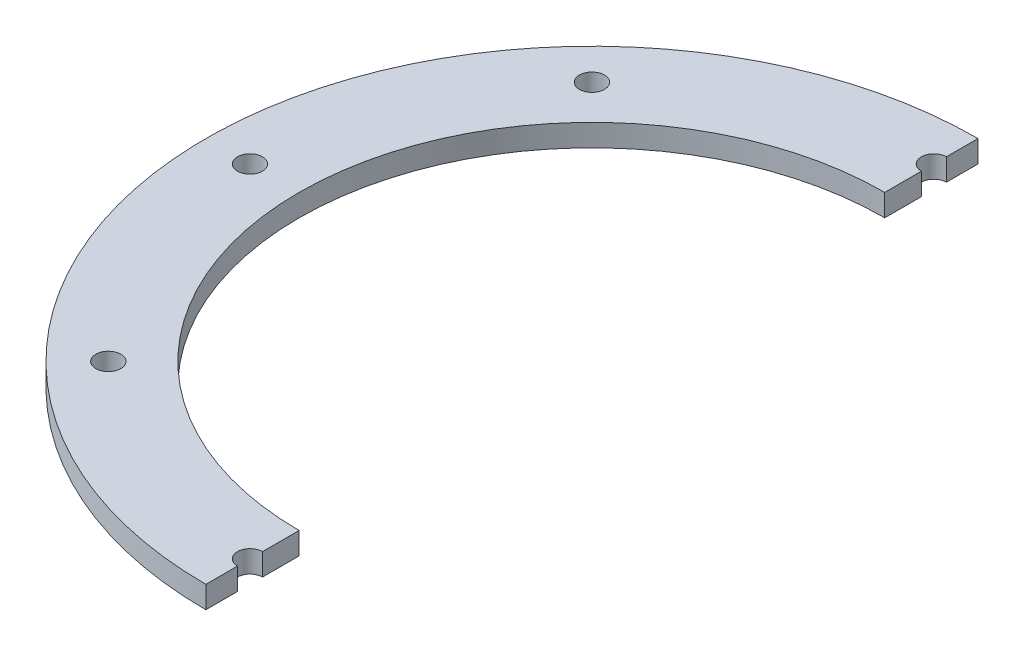
ISO-10303-21;
HEADER;
FILE_DESCRIPTION(('STEP AP214'),'2;1');
FILE_NAME('part.step','',(''),(''),'','','');
FILE_SCHEMA(('AUTOMOTIVE_DESIGN { 1 0 10303 214 1 1 1 1 }'));
ENDSEC;
DATA;
#1=APPLICATION_CONTEXT('core data for automotive mechanical design processes');
#2=APPLICATION_PROTOCOL_DEFINITION('international standard','automotive_design',2000,#1);
#3=PRODUCT_CONTEXT('',#1,'mechanical');
#4=PRODUCT('Part','Part','',(#3));
#5=PRODUCT_RELATED_PRODUCT_CATEGORY('part','',(#4));
#6=PRODUCT_DEFINITION_FORMATION('','',#4);
#7=PRODUCT_DEFINITION_CONTEXT('part definition',#1,'design');
#8=PRODUCT_DEFINITION('design','',#6,#7);
#9=PRODUCT_DEFINITION_SHAPE('','',#8);
#10=(LENGTH_UNIT() NAMED_UNIT(*) SI_UNIT(.MILLI.,.METRE.));
#11=(NAMED_UNIT(*) PLANE_ANGLE_UNIT() SI_UNIT($,.RADIAN.));
#12=(NAMED_UNIT(*) SI_UNIT($,.STERADIAN.) SOLID_ANGLE_UNIT());
#13=UNCERTAINTY_MEASURE_WITH_UNIT(LENGTH_MEASURE(1.E-05),#10,'distance_accuracy_value','');
#14=(GEOMETRIC_REPRESENTATION_CONTEXT(3) GLOBAL_UNCERTAINTY_ASSIGNED_CONTEXT((#13)) GLOBAL_UNIT_ASSIGNED_CONTEXT((#10,
#11,#12)) REPRESENTATION_CONTEXT('',''));
#15=CARTESIAN_POINT('',(0.,0.,0.));
#16=DIRECTION('',(0.,0.,1.));
#17=DIRECTION('',(1.,0.,0.));
#18=AXIS2_PLACEMENT_3D('',#15,#16,#17);
#19=CARTESIAN_POINT('',(0.,-3.,0.));
#20=DIRECTION('',(0.,-1.,0.));
#21=DIRECTION('',(0.,0.,-1.));
#22=AXIS2_PLACEMENT_3D('',#19,#20,#21);
#23=PLANE('',#22);
#24=CARTESIAN_POINT('',(-32.8804653251743,-3.,32.8804653251747));
#25=DIRECTION('',(0.,-1.,0.));
#26=DIRECTION('',(0.,0.,-1.));
#27=AXIS2_PLACEMENT_3D('',#24,#25,#26);
#28=CIRCLE('',#27,1.70000000000001);
#29=CARTESIAN_POINT('',(-32.8804653251743,-3.,31.1804653251746));
#30=VERTEX_POINT('',#29);
#31=EDGE_CURVE('E192',#30,#30,#28,.T.);
#32=ORIENTED_EDGE('',*,*,#31,.F.);
#33=EDGE_LOOP('',(#32));
#34=FACE_BOUND('',#33,.T.);
#35=CARTESIAN_POINT('',(0.,-3.,0.));
#36=DIRECTION('',(0.,1.,0.));
#37=DIRECTION('',(0.,0.,-1.));
#38=AXIS2_PLACEMENT_3D('',#35,#36,#37);
#39=CIRCLE('',#38,39.8164477613285);
#40=CARTESIAN_POINT('',(0.,-3.,-39.8164477613285));
#41=VERTEX_POINT('',#40);
#42=CARTESIAN_POINT('',(0.,-3.,39.8164477613285));
#43=VERTEX_POINT('',#42);
#44=EDGE_CURVE('E155',#41,#43,#39,.T.);
#45=ORIENTED_EDGE('',*,*,#44,.T.);
#46=DIRECTION('',(0.,0.,1.));
#47=VECTOR('',#46,1.);
#48=CARTESIAN_POINT('',(0.,-3.,44.8));
#49=LINE('',#48,#47);
#50=CARTESIAN_POINT('',(0.,-3.,44.8));
#51=VERTEX_POINT('',#50);
#52=EDGE_CURVE('E103',#43,#51,#49,.T.);
#53=ORIENTED_EDGE('',*,*,#52,.T.);
#54=CARTESIAN_POINT('',(0.,-3.,46.5));
#55=DIRECTION('',(0.,1.,0.));
#56=DIRECTION('',(0.,0.,-1.));
#57=AXIS2_PLACEMENT_3D('',#54,#55,#56);
#58=CIRCLE('',#57,1.7);
#59=CARTESIAN_POINT('',(0.,-3.,48.2));
#60=VERTEX_POINT('',#59);
#61=EDGE_CURVE('E170',#51,#60,#58,.T.);
#62=ORIENTED_EDGE('',*,*,#61,.T.);
#63=DIRECTION('',(0.,0.,1.));
#64=VECTOR('',#63,1.);
#65=CARTESIAN_POINT('',(0.,-3.,52.5));
#66=LINE('',#65,#64);
#67=CARTESIAN_POINT('',(0.,-3.,52.5));
#68=VERTEX_POINT('',#67);
#69=EDGE_CURVE('E183',#60,#68,#66,.T.);
#70=ORIENTED_EDGE('',*,*,#69,.T.);
#71=CARTESIAN_POINT('',(0.,-3.,0.));
#72=DIRECTION('',(0.,-1.,0.));
#73=DIRECTION('',(0.,0.,-1.));
#74=AXIS2_PLACEMENT_3D('',#71,#72,#73);
#75=CIRCLE('',#74,52.5);
#76=CARTESIAN_POINT('',(0.,-3.,-52.5));
#77=VERTEX_POINT('',#76);
#78=EDGE_CURVE('E122',#68,#77,#75,.T.);
#79=ORIENTED_EDGE('',*,*,#78,.T.);
#80=DIRECTION('',(0.,0.,1.));
#81=VECTOR('',#80,1.);
#82=CARTESIAN_POINT('',(0.,-3.,-48.2));
#83=LINE('',#82,#81);
#84=CARTESIAN_POINT('',(0.,-3.,-48.2));
#85=VERTEX_POINT('',#84);
#86=EDGE_CURVE('E116',#77,#85,#83,.T.);
#87=ORIENTED_EDGE('',*,*,#86,.T.);
#88=CARTESIAN_POINT('',(0.,-3.,-46.5));
#89=DIRECTION('',(0.,1.,0.));
#90=DIRECTION('',(0.,0.,-1.));
#91=AXIS2_PLACEMENT_3D('',#88,#89,#90);
#92=CIRCLE('',#91,1.7);
#93=CARTESIAN_POINT('',(0.,-3.,-44.8));
#94=VERTEX_POINT('',#93);
#95=EDGE_CURVE('E120',#85,#94,#92,.T.);
#96=ORIENTED_EDGE('',*,*,#95,.T.);
#97=DIRECTION('',(0.,0.,1.));
#98=VECTOR('',#97,1.);
#99=CARTESIAN_POINT('',(0.,-3.,-39.8164477613285));
#100=LINE('',#99,#98);
#101=EDGE_CURVE('E60',#94,#41,#100,.T.);
#102=ORIENTED_EDGE('',*,*,#101,.T.);
#103=EDGE_LOOP('',(#45,#53,#62,#70,#79,#87,#96,#102));
#104=FACE_BOUND('',#103,.T.);
#105=CARTESIAN_POINT('',(-46.5,-3.,0.));
#106=DIRECTION('',(0.,-1.,0.));
#107=DIRECTION('',(0.,0.,-1.));
#108=AXIS2_PLACEMENT_3D('',#105,#106,#107);
#109=CIRCLE('',#108,1.70000000000001);
#110=CARTESIAN_POINT('',(-46.5,-3.,-1.70000000000001));
#111=VERTEX_POINT('',#110);
#112=EDGE_CURVE('E144',#111,#111,#109,.T.);
#113=ORIENTED_EDGE('',*,*,#112,.F.);
#114=EDGE_LOOP('',(#113));
#115=FACE_BOUND('',#114,.T.);
#116=CARTESIAN_POINT('',(-32.8804653251743,-3.,-32.8804653251747));
#117=DIRECTION('',(0.,-1.,0.));
#118=DIRECTION('',(0.,0.,1.));
#119=AXIS2_PLACEMENT_3D('',#116,#117,#118);
#120=CIRCLE('',#119,1.70000000000001);
#121=CARTESIAN_POINT('',(-32.8804653251743,-3.,-31.1804653251746));
#122=VERTEX_POINT('',#121);
#123=EDGE_CURVE('E198',#122,#122,#120,.T.);
#124=ORIENTED_EDGE('',*,*,#123,.F.);
#125=EDGE_LOOP('',(#124));
#126=FACE_BOUND('',#125,.T.);
#127=ADVANCED_FACE('F43',(#34,#104,#115,#126),#23,.T.);
#128=CARTESIAN_POINT('',(0.,0.,0.));
#129=DIRECTION('',(0.,-1.,0.));
#130=DIRECTION('',(0.,0.,-1.));
#131=AXIS2_PLACEMENT_3D('',#128,#129,#130);
#132=PLANE('',#131);
#133=CARTESIAN_POINT('',(0.,0.,0.));
#134=DIRECTION('',(0.,1.,0.));
#135=DIRECTION('',(0.,0.,-1.));
#136=AXIS2_PLACEMENT_3D('',#133,#134,#135);
#137=CIRCLE('',#136,39.8164477613285);
#138=CARTESIAN_POINT('',(0.,0.,-39.8164477613285));
#139=VERTEX_POINT('',#138);
#140=CARTESIAN_POINT('',(0.,0.,39.8164477613285));
#141=VERTEX_POINT('',#140);
#142=EDGE_CURVE('E140',#139,#141,#137,.T.);
#143=ORIENTED_EDGE('',*,*,#142,.F.);
#144=DIRECTION('',(0.,0.,1.));
#145=VECTOR('',#144,1.);
#146=CARTESIAN_POINT('',(0.,0.,-39.8164477613285));
#147=LINE('',#146,#145);
#148=CARTESIAN_POINT('',(0.,0.,-44.8));
#149=VERTEX_POINT('',#148);
#150=EDGE_CURVE('E95',#149,#139,#147,.T.);
#151=ORIENTED_EDGE('',*,*,#150,.F.);
#152=CARTESIAN_POINT('',(0.,0.,-46.5));
#153=DIRECTION('',(0.,1.,0.));
#154=DIRECTION('',(0.,0.,-1.));
#155=AXIS2_PLACEMENT_3D('',#152,#153,#154);
#156=CIRCLE('',#155,1.7);
#157=CARTESIAN_POINT('',(0.,0.,-48.2));
#158=VERTEX_POINT('',#157);
#159=EDGE_CURVE('E89',#158,#149,#156,.T.);
#160=ORIENTED_EDGE('',*,*,#159,.F.);
#161=DIRECTION('',(0.,0.,1.));
#162=VECTOR('',#161,1.);
#163=CARTESIAN_POINT('',(0.,0.,-48.2));
#164=LINE('',#163,#162);
#165=CARTESIAN_POINT('',(0.,0.,-52.5));
#166=VERTEX_POINT('',#165);
#167=EDGE_CURVE('E130',#166,#158,#164,.T.);
#168=ORIENTED_EDGE('',*,*,#167,.F.);
#169=CARTESIAN_POINT('',(0.,0.,0.));
#170=DIRECTION('',(0.,-1.,0.));
#171=DIRECTION('',(0.,0.,-1.));
#172=AXIS2_PLACEMENT_3D('',#169,#170,#171);
#173=CIRCLE('',#172,52.5);
#174=CARTESIAN_POINT('',(0.,0.,52.5));
#175=VERTEX_POINT('',#174);
#176=EDGE_CURVE('E150',#175,#166,#173,.T.);
#177=ORIENTED_EDGE('',*,*,#176,.F.);
#178=DIRECTION('',(0.,0.,1.));
#179=VECTOR('',#178,1.);
#180=CARTESIAN_POINT('',(0.,0.,52.5));
#181=LINE('',#180,#179);
#182=CARTESIAN_POINT('',(0.,0.,48.2));
#183=VERTEX_POINT('',#182);
#184=EDGE_CURVE('E148',#183,#175,#181,.T.);
#185=ORIENTED_EDGE('',*,*,#184,.F.);
#186=CARTESIAN_POINT('',(0.,0.,46.5));
#187=DIRECTION('',(0.,1.,0.));
#188=DIRECTION('',(0.,0.,-1.));
#189=AXIS2_PLACEMENT_3D('',#186,#187,#188);
#190=CIRCLE('',#189,1.7);
#191=CARTESIAN_POINT('',(0.,0.,44.8));
#192=VERTEX_POINT('',#191);
#193=EDGE_CURVE('E146',#192,#183,#190,.T.);
#194=ORIENTED_EDGE('',*,*,#193,.F.);
#195=DIRECTION('',(0.,0.,1.));
#196=VECTOR('',#195,1.);
#197=CARTESIAN_POINT('',(0.,0.,44.8));
#198=LINE('',#197,#196);
#199=EDGE_CURVE('E143',#141,#192,#198,.T.);
#200=ORIENTED_EDGE('',*,*,#199,.F.);
#201=EDGE_LOOP('',(#143,#151,#160,#168,#177,#185,#194,#200));
#202=FACE_BOUND('',#201,.T.);
#203=CARTESIAN_POINT('',(-46.5,0.,0.));
#204=DIRECTION('',(0.,-1.,0.));
#205=DIRECTION('',(0.,0.,-1.));
#206=AXIS2_PLACEMENT_3D('',#203,#204,#205);
#207=CIRCLE('',#206,1.70000000000001);
#208=CARTESIAN_POINT('',(-46.5,0.,-1.70000000000001));
#209=VERTEX_POINT('',#208);
#210=EDGE_CURVE('E189',#209,#209,#207,.T.);
#211=ORIENTED_EDGE('',*,*,#210,.T.);
#212=EDGE_LOOP('',(#211));
#213=FACE_BOUND('',#212,.T.);
#214=CARTESIAN_POINT('',(-32.8804653251743,0.,32.8804653251747));
#215=DIRECTION('',(0.,-1.,0.));
#216=DIRECTION('',(0.,0.,-1.));
#217=AXIS2_PLACEMENT_3D('',#214,#215,#216);
#218=CIRCLE('',#217,1.70000000000001);
#219=CARTESIAN_POINT('',(-32.8804653251743,0.,31.1804653251746));
#220=VERTEX_POINT('',#219);
#221=EDGE_CURVE('E195',#220,#220,#218,.T.);
#222=ORIENTED_EDGE('',*,*,#221,.T.);
#223=EDGE_LOOP('',(#222));
#224=FACE_BOUND('',#223,.T.);
#225=CARTESIAN_POINT('',(-32.8804653251743,0.,-32.8804653251747));
#226=DIRECTION('',(0.,-1.,0.));
#227=DIRECTION('',(0.,0.,1.));
#228=AXIS2_PLACEMENT_3D('',#225,#226,#227);
#229=CIRCLE('',#228,1.70000000000001);
#230=CARTESIAN_POINT('',(-32.8804653251743,0.,-31.1804653251746));
#231=VERTEX_POINT('',#230);
#232=EDGE_CURVE('E201',#231,#231,#229,.T.);
#233=ORIENTED_EDGE('',*,*,#232,.T.);
#234=EDGE_LOOP('',(#233));
#235=FACE_BOUND('',#234,.T.);
#236=ADVANCED_FACE('F174',(#202,#213,#224,#235),#132,.F.);
#237=CARTESIAN_POINT('',(0.,-3.,0.));
#238=DIRECTION('',(0.,1.,0.));
#239=DIRECTION('',(0.,0.,1.));
#240=AXIS2_PLACEMENT_3D('',#237,#238,#239);
#241=CYLINDRICAL_SURFACE('',#240,39.8164477613285);
#242=ORIENTED_EDGE('',*,*,#142,.T.);
#243=DIRECTION('',(0.,1.,0.));
#244=VECTOR('',#243,1.);
#245=CARTESIAN_POINT('',(0.,-3.,39.8164477613285));
#246=LINE('',#245,#244);
#247=EDGE_CURVE('E11',#43,#141,#246,.T.);
#248=ORIENTED_EDGE('',*,*,#247,.F.);
#249=ORIENTED_EDGE('',*,*,#44,.F.);
#250=DIRECTION('',(0.,1.,0.));
#251=VECTOR('',#250,1.);
#252=CARTESIAN_POINT('',(0.,-3.,-39.8164477613285));
#253=LINE('',#252,#251);
#254=EDGE_CURVE('E136',#41,#139,#253,.T.);
#255=ORIENTED_EDGE('',*,*,#254,.T.);
#256=EDGE_LOOP('',(#242,#248,#249,#255));
#257=FACE_BOUND('',#256,.T.);
#258=ADVANCED_FACE('F45',(#257),#241,.F.);
#259=CARTESIAN_POINT('',(0.,-3.,44.8));
#260=DIRECTION('',(-1.,0.,0.));
#261=DIRECTION('',(0.,0.,1.));
#262=AXIS2_PLACEMENT_3D('',#259,#260,#261);
#263=PLANE('',#262);
#264=ORIENTED_EDGE('',*,*,#199,.T.);
#265=DIRECTION('',(0.,1.,0.));
#266=VECTOR('',#265,1.);
#267=CARTESIAN_POINT('',(0.,-3.,44.8));
#268=LINE('',#267,#266);
#269=EDGE_CURVE('E52',#51,#192,#268,.T.);
#270=ORIENTED_EDGE('',*,*,#269,.F.);
#271=ORIENTED_EDGE('',*,*,#52,.F.);
#272=ORIENTED_EDGE('',*,*,#247,.T.);
#273=EDGE_LOOP('',(#264,#270,#271,#272));
#274=FACE_BOUND('',#273,.T.);
#275=ADVANCED_FACE('F234',(#274),#263,.F.);
#276=CARTESIAN_POINT('',(0.,-3.,46.5));
#277=DIRECTION('',(0.,1.,0.));
#278=DIRECTION('',(0.,0.,1.));
#279=AXIS2_PLACEMENT_3D('',#276,#277,#278);
#280=CYLINDRICAL_SURFACE('',#279,1.7);
#281=ORIENTED_EDGE('',*,*,#193,.T.);
#282=DIRECTION('',(0.,1.,0.));
#283=VECTOR('',#282,1.);
#284=CARTESIAN_POINT('',(0.,-3.,48.2));
#285=LINE('',#284,#283);
#286=EDGE_CURVE('E162',#60,#183,#285,.T.);
#287=ORIENTED_EDGE('',*,*,#286,.F.);
#288=ORIENTED_EDGE('',*,*,#61,.F.);
#289=ORIENTED_EDGE('',*,*,#269,.T.);
#290=EDGE_LOOP('',(#281,#287,#288,#289));
#291=FACE_BOUND('',#290,.T.);
#292=ADVANCED_FACE('F168',(#291),#280,.F.);
#293=CARTESIAN_POINT('',(0.,-3.,52.5));
#294=DIRECTION('',(-1.,0.,0.));
#295=DIRECTION('',(0.,0.,1.));
#296=AXIS2_PLACEMENT_3D('',#293,#294,#295);
#297=PLANE('',#296);
#298=ORIENTED_EDGE('',*,*,#184,.T.);
#299=DIRECTION('',(0.,1.,0.));
#300=VECTOR('',#299,1.);
#301=CARTESIAN_POINT('',(0.,-3.,52.5));
#302=LINE('',#301,#300);
#303=EDGE_CURVE('E159',#68,#175,#302,.T.);
#304=ORIENTED_EDGE('',*,*,#303,.F.);
#305=ORIENTED_EDGE('',*,*,#69,.F.);
#306=ORIENTED_EDGE('',*,*,#286,.T.);
#307=EDGE_LOOP('',(#298,#304,#305,#306));
#308=FACE_BOUND('',#307,.T.);
#309=ADVANCED_FACE('F179',(#308),#297,.F.);
#310=CARTESIAN_POINT('',(0.,-3.,0.));
#311=DIRECTION('',(0.,1.,0.));
#312=DIRECTION('',(0.,0.,1.));
#313=AXIS2_PLACEMENT_3D('',#310,#311,#312);
#314=CYLINDRICAL_SURFACE('',#313,52.5);
#315=ORIENTED_EDGE('',*,*,#176,.T.);
#316=DIRECTION('',(0.,1.,0.));
#317=VECTOR('',#316,1.);
#318=CARTESIAN_POINT('',(0.,-3.,-52.5));
#319=LINE('',#318,#317);
#320=EDGE_CURVE('E131',#77,#166,#319,.T.);
#321=ORIENTED_EDGE('',*,*,#320,.F.);
#322=ORIENTED_EDGE('',*,*,#78,.F.);
#323=ORIENTED_EDGE('',*,*,#303,.T.);
#324=EDGE_LOOP('',(#315,#321,#322,#323));
#325=FACE_BOUND('',#324,.T.);
#326=ADVANCED_FACE('F182',(#325),#314,.T.);
#327=CARTESIAN_POINT('',(0.,-3.,-48.2));
#328=DIRECTION('',(-1.,0.,0.));
#329=DIRECTION('',(0.,0.,1.));
#330=AXIS2_PLACEMENT_3D('',#327,#328,#329);
#331=PLANE('',#330);
#332=ORIENTED_EDGE('',*,*,#167,.T.);
#333=DIRECTION('',(0.,1.,0.));
#334=VECTOR('',#333,1.);
#335=CARTESIAN_POINT('',(0.,-3.,-48.2));
#336=LINE('',#335,#334);
#337=EDGE_CURVE('E127',#85,#158,#336,.T.);
#338=ORIENTED_EDGE('',*,*,#337,.F.);
#339=ORIENTED_EDGE('',*,*,#86,.F.);
#340=ORIENTED_EDGE('',*,*,#320,.T.);
#341=EDGE_LOOP('',(#332,#338,#339,#340));
#342=FACE_BOUND('',#341,.T.);
#343=ADVANCED_FACE('F128',(#342),#331,.F.);
#344=CARTESIAN_POINT('',(0.,-3.,-46.5));
#345=DIRECTION('',(0.,1.,0.));
#346=DIRECTION('',(0.,0.,1.));
#347=AXIS2_PLACEMENT_3D('',#344,#345,#346);
#348=CYLINDRICAL_SURFACE('',#347,1.7);
#349=ORIENTED_EDGE('',*,*,#159,.T.);
#350=DIRECTION('',(0.,1.,0.));
#351=VECTOR('',#350,1.);
#352=CARTESIAN_POINT('',(0.,-3.,-44.8));
#353=LINE('',#352,#351);
#354=EDGE_CURVE('E132',#94,#149,#353,.T.);
#355=ORIENTED_EDGE('',*,*,#354,.F.);
#356=ORIENTED_EDGE('',*,*,#95,.F.);
#357=ORIENTED_EDGE('',*,*,#337,.T.);
#358=EDGE_LOOP('',(#349,#355,#356,#357));
#359=FACE_BOUND('',#358,.T.);
#360=ADVANCED_FACE('F134',(#359),#348,.F.);
#361=CARTESIAN_POINT('',(0.,-3.,-39.8164477613285));
#362=DIRECTION('',(-1.,0.,0.));
#363=DIRECTION('',(0.,0.,1.));
#364=AXIS2_PLACEMENT_3D('',#361,#362,#363);
#365=PLANE('',#364);
#366=ORIENTED_EDGE('',*,*,#150,.T.);
#367=ORIENTED_EDGE('',*,*,#254,.F.);
#368=ORIENTED_EDGE('',*,*,#101,.F.);
#369=ORIENTED_EDGE('',*,*,#354,.T.);
#370=EDGE_LOOP('',(#366,#367,#368,#369));
#371=FACE_BOUND('',#370,.T.);
#372=ADVANCED_FACE('F222',(#371),#365,.F.);
#373=CARTESIAN_POINT('',(-46.5,-3.,0.));
#374=DIRECTION('',(0.,1.,0.));
#375=DIRECTION('',(0.,0.,1.));
#376=AXIS2_PLACEMENT_3D('',#373,#374,#375);
#377=CYLINDRICAL_SURFACE('',#376,1.70000000000001);
#378=ORIENTED_EDGE('',*,*,#112,.T.);
#379=EDGE_LOOP('',(#378));
#380=FACE_BOUND('',#379,.T.);
#381=ORIENTED_EDGE('',*,*,#210,.F.);
#382=EDGE_LOOP('',(#381));
#383=FACE_BOUND('',#382,.T.);
#384=ADVANCED_FACE('F219',(#380,#383),#377,.F.);
#385=CARTESIAN_POINT('',(-32.8804653251743,-3.,32.8804653251747));
#386=DIRECTION('',(0.,1.,0.));
#387=DIRECTION('',(0.,0.,1.));
#388=AXIS2_PLACEMENT_3D('',#385,#386,#387);
#389=CYLINDRICAL_SURFACE('',#388,1.70000000000001);
#390=ORIENTED_EDGE('',*,*,#31,.T.);
#391=EDGE_LOOP('',(#390));
#392=FACE_BOUND('',#391,.T.);
#393=ORIENTED_EDGE('',*,*,#221,.F.);
#394=EDGE_LOOP('',(#393));
#395=FACE_BOUND('',#394,.T.);
#396=ADVANCED_FACE('F332',(#392,#395),#389,.F.);
#397=CARTESIAN_POINT('',(-32.8804653251743,-3.,-32.8804653251747));
#398=DIRECTION('',(0.,1.,0.));
#399=DIRECTION('',(0.,0.,1.));
#400=AXIS2_PLACEMENT_3D('',#397,#398,#399);
#401=CYLINDRICAL_SURFACE('',#400,1.70000000000001);
#402=ORIENTED_EDGE('',*,*,#123,.T.);
#403=EDGE_LOOP('',(#402));
#404=FACE_BOUND('',#403,.T.);
#405=ORIENTED_EDGE('',*,*,#232,.F.);
#406=EDGE_LOOP('',(#405));
#407=FACE_BOUND('',#406,.T.);
#408=ADVANCED_FACE('F207',(#404,#407),#401,.F.);
#409=CLOSED_SHELL('',(#127,#236,#258,#275,#292,#309,#326,#343,#360,#372,#384,#396,#408));
#410=MANIFOLD_SOLID_BREP('B2',#409);
#411=ADVANCED_BREP_SHAPE_REPRESENTATION('',(#18,#410),#14);
#412=SHAPE_DEFINITION_REPRESENTATION(#9,#411);
ENDSEC;
END-ISO-10303-21;
